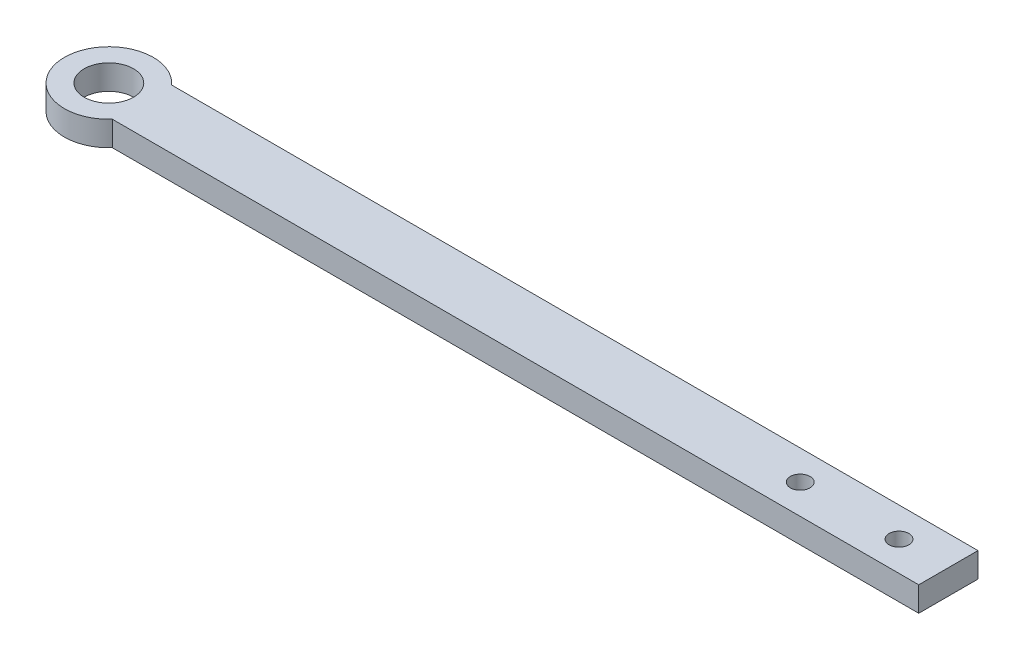
ISO-10303-21;
HEADER;
FILE_DESCRIPTION(('STEP AP214'),'2;1');
FILE_NAME('part.step','',(''),(''),'','','');
FILE_SCHEMA(('AUTOMOTIVE_DESIGN { 1 0 10303 214 1 1 1 1 }'));
ENDSEC;
DATA;
#1=APPLICATION_CONTEXT('core data for automotive mechanical design processes');
#2=APPLICATION_PROTOCOL_DEFINITION('international standard','automotive_design',2000,#1);
#3=PRODUCT_CONTEXT('',#1,'mechanical');
#4=PRODUCT('Part','Part','',(#3));
#5=PRODUCT_RELATED_PRODUCT_CATEGORY('part','',(#4));
#6=PRODUCT_DEFINITION_FORMATION('','',#4);
#7=PRODUCT_DEFINITION_CONTEXT('part definition',#1,'design');
#8=PRODUCT_DEFINITION('design','',#6,#7);
#9=PRODUCT_DEFINITION_SHAPE('','',#8);
#10=(LENGTH_UNIT() NAMED_UNIT(*) SI_UNIT(.MILLI.,.METRE.));
#11=(NAMED_UNIT(*) PLANE_ANGLE_UNIT() SI_UNIT($,.RADIAN.));
#12=(NAMED_UNIT(*) SI_UNIT($,.STERADIAN.) SOLID_ANGLE_UNIT());
#13=UNCERTAINTY_MEASURE_WITH_UNIT(LENGTH_MEASURE(1.E-05),#10,'distance_accuracy_value','');
#14=(GEOMETRIC_REPRESENTATION_CONTEXT(3) GLOBAL_UNCERTAINTY_ASSIGNED_CONTEXT((#13)) GLOBAL_UNIT_ASSIGNED_CONTEXT((#10,
#11,#12)) REPRESENTATION_CONTEXT('',''));
#15=CARTESIAN_POINT('',(0.,0.,0.));
#16=DIRECTION('',(0.,0.,1.));
#17=DIRECTION('',(1.,0.,0.));
#18=AXIS2_PLACEMENT_3D('',#15,#16,#17);
#19=CARTESIAN_POINT('',(170.,5.,-6.));
#20=DIRECTION('',(-1.,0.,0.));
#21=DIRECTION('',(0.,0.,1.));
#22=AXIS2_PLACEMENT_3D('',#19,#20,#21);
#23=PLANE('',#22);
#24=DIRECTION('',(0.,0.,-1.));
#25=VECTOR('',#24,1.);
#26=CARTESIAN_POINT('',(170.,0.,-6.));
#27=LINE('',#26,#25);
#28=CARTESIAN_POINT('',(170.,0.,6.));
#29=VERTEX_POINT('',#28);
#30=CARTESIAN_POINT('',(170.,0.,-6.));
#31=VERTEX_POINT('',#30);
#32=EDGE_CURVE('E113',#29,#31,#27,.T.);
#33=ORIENTED_EDGE('',*,*,#32,.T.);
#34=DIRECTION('',(0.,-1.,0.));
#35=VECTOR('',#34,1.);
#36=CARTESIAN_POINT('',(170.,5.,-6.));
#37=LINE('',#36,#35);
#38=CARTESIAN_POINT('',(170.,5.,-6.));
#39=VERTEX_POINT('',#38);
#40=EDGE_CURVE('E11',#39,#31,#37,.T.);
#41=ORIENTED_EDGE('',*,*,#40,.F.);
#42=DIRECTION('',(0.,0.,-1.));
#43=VECTOR('',#42,1.);
#44=CARTESIAN_POINT('',(170.,5.,-6.));
#45=LINE('',#44,#43);
#46=CARTESIAN_POINT('',(170.,5.,6.));
#47=VERTEX_POINT('',#46);
#48=EDGE_CURVE('E97',#47,#39,#45,.T.);
#49=ORIENTED_EDGE('',*,*,#48,.F.);
#50=DIRECTION('',(0.,-1.,0.));
#51=VECTOR('',#50,1.);
#52=CARTESIAN_POINT('',(170.,5.,6.));
#53=LINE('',#52,#51);
#54=EDGE_CURVE('E109',#47,#29,#53,.T.);
#55=ORIENTED_EDGE('',*,*,#54,.T.);
#56=EDGE_LOOP('',(#33,#41,#49,#55));
#57=FACE_BOUND('',#56,.T.);
#58=ADVANCED_FACE('F45',(#57),#23,.F.);
#59=CARTESIAN_POINT('',(6.70820393249937,5.,-6.));
#60=DIRECTION('',(0.,0.,1.));
#61=DIRECTION('',(1.,0.,0.));
#62=AXIS2_PLACEMENT_3D('',#59,#60,#61);
#63=PLANE('',#62);
#64=DIRECTION('',(-1.,0.,0.));
#65=VECTOR('',#64,1.);
#66=CARTESIAN_POINT('',(6.70820393249937,0.,-6.));
#67=LINE('',#66,#65);
#68=CARTESIAN_POINT('',(6.70820393249937,0.,-6.));
#69=VERTEX_POINT('',#68);
#70=EDGE_CURVE('E102',#31,#69,#67,.T.);
#71=ORIENTED_EDGE('',*,*,#70,.T.);
#72=DIRECTION('',(0.,-1.,0.));
#73=VECTOR('',#72,1.);
#74=CARTESIAN_POINT('',(6.70820393249937,5.,-6.));
#75=LINE('',#74,#73);
#76=CARTESIAN_POINT('',(6.70820393249937,5.,-6.));
#77=VERTEX_POINT('',#76);
#78=EDGE_CURVE('E54',#77,#69,#75,.T.);
#79=ORIENTED_EDGE('',*,*,#78,.F.);
#80=DIRECTION('',(-1.,0.,0.));
#81=VECTOR('',#80,1.);
#82=CARTESIAN_POINT('',(6.70820393249937,5.,-6.));
#83=LINE('',#82,#81);
#84=EDGE_CURVE('E92',#39,#77,#83,.T.);
#85=ORIENTED_EDGE('',*,*,#84,.F.);
#86=ORIENTED_EDGE('',*,*,#40,.T.);
#87=EDGE_LOOP('',(#71,#79,#85,#86));
#88=FACE_BOUND('',#87,.T.);
#89=ADVANCED_FACE('F101',(#88),#63,.F.);
#90=CARTESIAN_POINT('',(0.,5.,0.));
#91=DIRECTION('',(0.,-1.,0.));
#92=DIRECTION('',(0.,0.,-1.));
#93=AXIS2_PLACEMENT_3D('',#90,#91,#92);
#94=CYLINDRICAL_SURFACE('',#93,9.);
#95=CARTESIAN_POINT('',(0.,0.,0.));
#96=DIRECTION('',(0.,1.,0.));
#97=DIRECTION('',(0.,0.,1.));
#98=AXIS2_PLACEMENT_3D('',#95,#96,#97);
#99=CIRCLE('',#98,9.);
#100=CARTESIAN_POINT('',(6.70820393249937,0.,6.));
#101=VERTEX_POINT('',#100);
#102=EDGE_CURVE('E79',#69,#101,#99,.T.);
#103=ORIENTED_EDGE('',*,*,#102,.T.);
#104=DIRECTION('',(0.,-1.,0.));
#105=VECTOR('',#104,1.);
#106=CARTESIAN_POINT('',(6.70820393249937,5.,6.));
#107=LINE('',#106,#105);
#108=CARTESIAN_POINT('',(6.70820393249937,5.,6.));
#109=VERTEX_POINT('',#108);
#110=EDGE_CURVE('E104',#109,#101,#107,.T.);
#111=ORIENTED_EDGE('',*,*,#110,.F.);
#112=CARTESIAN_POINT('',(0.,5.,0.));
#113=DIRECTION('',(0.,1.,0.));
#114=DIRECTION('',(0.,0.,1.));
#115=AXIS2_PLACEMENT_3D('',#112,#113,#114);
#116=CIRCLE('',#115,9.);
#117=EDGE_CURVE('E95',#77,#109,#116,.T.);
#118=ORIENTED_EDGE('',*,*,#117,.F.);
#119=ORIENTED_EDGE('',*,*,#78,.T.);
#120=EDGE_LOOP('',(#103,#111,#118,#119));
#121=FACE_BOUND('',#120,.T.);
#122=ADVANCED_FACE('F105',(#121),#94,.T.);
#123=CARTESIAN_POINT('',(170.,5.,6.));
#124=DIRECTION('',(0.,0.,-1.));
#125=DIRECTION('',(-1.,0.,0.));
#126=AXIS2_PLACEMENT_3D('',#123,#124,#125);
#127=PLANE('',#126);
#128=DIRECTION('',(1.,0.,0.));
#129=VECTOR('',#128,1.);
#130=CARTESIAN_POINT('',(170.,0.,6.));
#131=LINE('',#130,#129);
#132=EDGE_CURVE('E85',#101,#29,#131,.T.);
#133=ORIENTED_EDGE('',*,*,#132,.T.);
#134=ORIENTED_EDGE('',*,*,#54,.F.);
#135=DIRECTION('',(1.,0.,0.));
#136=VECTOR('',#135,1.);
#137=CARTESIAN_POINT('',(170.,5.,6.));
#138=LINE('',#137,#136);
#139=EDGE_CURVE('E62',#109,#47,#138,.T.);
#140=ORIENTED_EDGE('',*,*,#139,.F.);
#141=ORIENTED_EDGE('',*,*,#110,.T.);
#142=EDGE_LOOP('',(#133,#134,#140,#141));
#143=FACE_BOUND('',#142,.T.);
#144=ADVANCED_FACE('F127',(#143),#127,.F.);
#145=CARTESIAN_POINT('',(0.,5.,0.));
#146=DIRECTION('',(0.,1.,0.));
#147=DIRECTION('',(0.,0.,1.));
#148=AXIS2_PLACEMENT_3D('',#145,#146,#147);
#149=PLANE('',#148);
#150=CARTESIAN_POINT('',(0.,5.,0.));
#151=DIRECTION('',(0.,1.,0.));
#152=DIRECTION('',(0.,0.,1.));
#153=AXIS2_PLACEMENT_3D('',#150,#151,#152);
#154=CIRCLE('',#153,5.);
#155=CARTESIAN_POINT('',(0.,5.,5.));
#156=VERTEX_POINT('',#155);
#157=EDGE_CURVE('E150',#156,#156,#154,.T.);
#158=ORIENTED_EDGE('',*,*,#157,.F.);
#159=EDGE_LOOP('',(#158));
#160=FACE_BOUND('',#159,.T.);
#161=CARTESIAN_POINT('',(160.,5.,0.));
#162=DIRECTION('',(0.,1.,0.));
#163=DIRECTION('',(0.,0.,1.));
#164=AXIS2_PLACEMENT_3D('',#161,#162,#163);
#165=CIRCLE('',#164,2.);
#166=CARTESIAN_POINT('',(160.,5.,2.));
#167=VERTEX_POINT('',#166);
#168=EDGE_CURVE('E146',#167,#167,#165,.T.);
#169=ORIENTED_EDGE('',*,*,#168,.F.);
#170=EDGE_LOOP('',(#169));
#171=FACE_BOUND('',#170,.T.);
#172=CARTESIAN_POINT('',(140.,5.,0.));
#173=DIRECTION('',(0.,1.,0.));
#174=DIRECTION('',(0.,0.,1.));
#175=AXIS2_PLACEMENT_3D('',#172,#173,#174);
#176=CIRCLE('',#175,2.);
#177=CARTESIAN_POINT('',(140.,5.,2.));
#178=VERTEX_POINT('',#177);
#179=EDGE_CURVE('E138',#178,#178,#176,.T.);
#180=ORIENTED_EDGE('',*,*,#179,.F.);
#181=EDGE_LOOP('',(#180));
#182=FACE_BOUND('',#181,.T.);
#183=ORIENTED_EDGE('',*,*,#48,.T.);
#184=ORIENTED_EDGE('',*,*,#84,.T.);
#185=ORIENTED_EDGE('',*,*,#117,.T.);
#186=ORIENTED_EDGE('',*,*,#139,.T.);
#187=EDGE_LOOP('',(#183,#184,#185,#186));
#188=FACE_BOUND('',#187,.T.);
#189=ADVANCED_FACE('F93',(#160,#171,#182,#188),#149,.T.);
#190=CARTESIAN_POINT('',(0.,0.,0.));
#191=DIRECTION('',(0.,1.,0.));
#192=DIRECTION('',(0.,0.,1.));
#193=AXIS2_PLACEMENT_3D('',#190,#191,#192);
#194=PLANE('',#193);
#195=CARTESIAN_POINT('',(0.,0.,0.));
#196=DIRECTION('',(0.,1.,0.));
#197=DIRECTION('',(0.,0.,1.));
#198=AXIS2_PLACEMENT_3D('',#195,#196,#197);
#199=CIRCLE('',#198,5.);
#200=CARTESIAN_POINT('',(0.,0.,5.));
#201=VERTEX_POINT('',#200);
#202=EDGE_CURVE('E117',#201,#201,#199,.T.);
#203=ORIENTED_EDGE('',*,*,#202,.T.);
#204=EDGE_LOOP('',(#203));
#205=FACE_BOUND('',#204,.T.);
#206=CARTESIAN_POINT('',(160.,0.,0.));
#207=DIRECTION('',(0.,1.,0.));
#208=DIRECTION('',(0.,0.,1.));
#209=AXIS2_PLACEMENT_3D('',#206,#207,#208);
#210=CIRCLE('',#209,2.);
#211=CARTESIAN_POINT('',(160.,0.,2.));
#212=VERTEX_POINT('',#211);
#213=EDGE_CURVE('E142',#212,#212,#210,.T.);
#214=ORIENTED_EDGE('',*,*,#213,.T.);
#215=EDGE_LOOP('',(#214));
#216=FACE_BOUND('',#215,.T.);
#217=CARTESIAN_POINT('',(140.,0.,0.));
#218=DIRECTION('',(0.,1.,0.));
#219=DIRECTION('',(0.,0.,1.));
#220=AXIS2_PLACEMENT_3D('',#217,#218,#219);
#221=CIRCLE('',#220,2.);
#222=CARTESIAN_POINT('',(140.,0.,2.));
#223=VERTEX_POINT('',#222);
#224=EDGE_CURVE('E134',#223,#223,#221,.T.);
#225=ORIENTED_EDGE('',*,*,#224,.T.);
#226=EDGE_LOOP('',(#225));
#227=FACE_BOUND('',#226,.T.);
#228=ORIENTED_EDGE('',*,*,#32,.F.);
#229=ORIENTED_EDGE('',*,*,#132,.F.);
#230=ORIENTED_EDGE('',*,*,#102,.F.);
#231=ORIENTED_EDGE('',*,*,#70,.F.);
#232=EDGE_LOOP('',(#228,#229,#230,#231));
#233=FACE_BOUND('',#232,.T.);
#234=ADVANCED_FACE('F130',(#205,#216,#227,#233),#194,.F.);
#235=CARTESIAN_POINT('',(140.,0.,0.));
#236=DIRECTION('',(0.,1.,0.));
#237=DIRECTION('',(0.,0.,1.));
#238=AXIS2_PLACEMENT_3D('',#235,#236,#237);
#239=CYLINDRICAL_SURFACE('',#238,2.);
#240=ORIENTED_EDGE('',*,*,#224,.F.);
#241=EDGE_LOOP('',(#240));
#242=FACE_BOUND('',#241,.T.);
#243=ORIENTED_EDGE('',*,*,#179,.T.);
#244=EDGE_LOOP('',(#243));
#245=FACE_BOUND('',#244,.T.);
#246=ADVANCED_FACE('F174',(#242,#245),#239,.F.);
#247=CARTESIAN_POINT('',(160.,0.,0.));
#248=DIRECTION('',(0.,1.,0.));
#249=DIRECTION('',(0.,0.,1.));
#250=AXIS2_PLACEMENT_3D('',#247,#248,#249);
#251=CYLINDRICAL_SURFACE('',#250,2.);
#252=ORIENTED_EDGE('',*,*,#213,.F.);
#253=EDGE_LOOP('',(#252));
#254=FACE_BOUND('',#253,.T.);
#255=ORIENTED_EDGE('',*,*,#168,.T.);
#256=EDGE_LOOP('',(#255));
#257=FACE_BOUND('',#256,.T.);
#258=ADVANCED_FACE('F163',(#254,#257),#251,.F.);
#259=CARTESIAN_POINT('',(0.,0.,0.));
#260=DIRECTION('',(0.,1.,0.));
#261=DIRECTION('',(0.,0.,1.));
#262=AXIS2_PLACEMENT_3D('',#259,#260,#261);
#263=CYLINDRICAL_SURFACE('',#262,5.);
#264=ORIENTED_EDGE('',*,*,#202,.F.);
#265=EDGE_LOOP('',(#264));
#266=FACE_BOUND('',#265,.T.);
#267=ORIENTED_EDGE('',*,*,#157,.T.);
#268=EDGE_LOOP('',(#267));
#269=FACE_BOUND('',#268,.T.);
#270=ADVANCED_FACE('F160',(#266,#269),#263,.F.);
#271=CLOSED_SHELL('',(#58,#89,#122,#144,#189,#234,#246,#258,#270));
#272=MANIFOLD_SOLID_BREP('B2',#271);
#273=ADVANCED_BREP_SHAPE_REPRESENTATION('',(#18,#272),#14);
#274=SHAPE_DEFINITION_REPRESENTATION(#9,#273);
ENDSEC;
END-ISO-10303-21;
